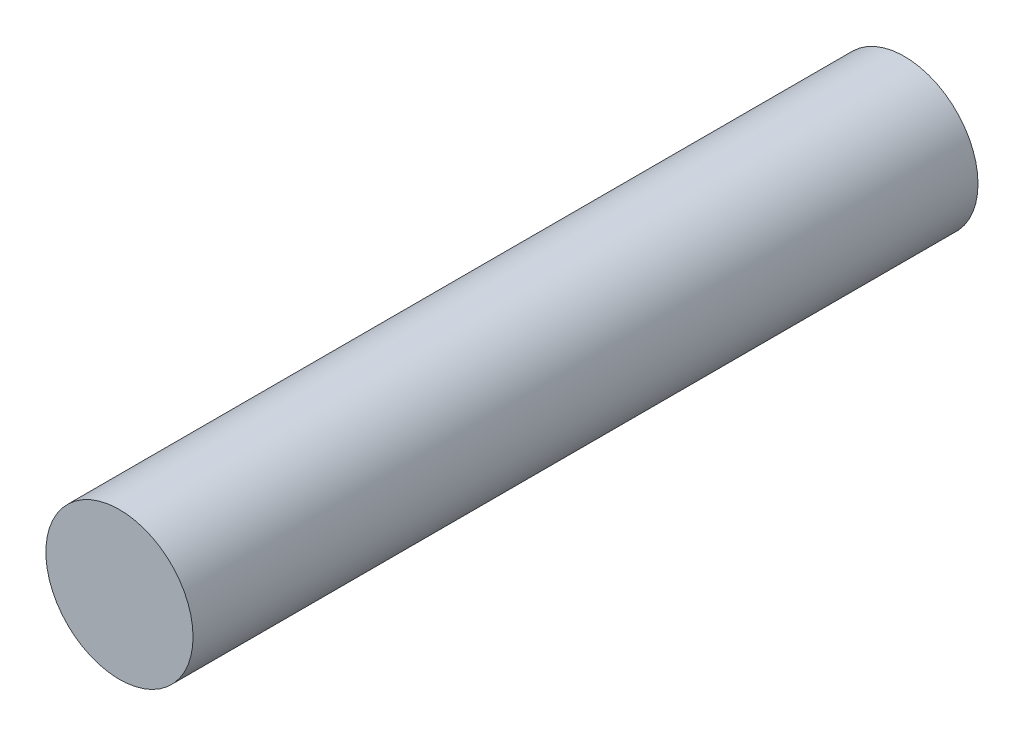
ISO-10303-21;
HEADER;
FILE_DESCRIPTION(('STEP AP214'),'2;1');
FILE_NAME('part.step','',(''),(''),'','','');
FILE_SCHEMA(('AUTOMOTIVE_DESIGN { 1 0 10303 214 1 1 1 1 }'));
ENDSEC;
DATA;
#1=APPLICATION_CONTEXT('core data for automotive mechanical design processes');
#2=APPLICATION_PROTOCOL_DEFINITION('international standard','automotive_design',2000,#1);
#3=PRODUCT_CONTEXT('',#1,'mechanical');
#4=PRODUCT('Part','Part','',(#3));
#5=PRODUCT_RELATED_PRODUCT_CATEGORY('part','',(#4));
#6=PRODUCT_DEFINITION_FORMATION('','',#4);
#7=PRODUCT_DEFINITION_CONTEXT('part definition',#1,'design');
#8=PRODUCT_DEFINITION('design','',#6,#7);
#9=PRODUCT_DEFINITION_SHAPE('','',#8);
#10=(LENGTH_UNIT() NAMED_UNIT(*) SI_UNIT(.MILLI.,.METRE.));
#11=(NAMED_UNIT(*) PLANE_ANGLE_UNIT() SI_UNIT($,.RADIAN.));
#12=(NAMED_UNIT(*) SI_UNIT($,.STERADIAN.) SOLID_ANGLE_UNIT());
#13=UNCERTAINTY_MEASURE_WITH_UNIT(LENGTH_MEASURE(1.E-05),#10,'distance_accuracy_value','');
#14=(GEOMETRIC_REPRESENTATION_CONTEXT(3) GLOBAL_UNCERTAINTY_ASSIGNED_CONTEXT((#13)) GLOBAL_UNIT_ASSIGNED_CONTEXT((#10,
#11,#12)) REPRESENTATION_CONTEXT('',''));
#15=CARTESIAN_POINT('',(0.,0.,0.));
#16=DIRECTION('',(0.,0.,1.));
#17=DIRECTION('',(1.,0.,0.));
#18=AXIS2_PLACEMENT_3D('',#15,#16,#17);
#19=CARTESIAN_POINT('',(0.,0.,-50.8));
#20=DIRECTION('',(0.,0.,1.));
#21=DIRECTION('',(1.,0.,0.));
#22=AXIS2_PLACEMENT_3D('',#19,#20,#21);
#23=CYLINDRICAL_SURFACE('',#22,4.7625);
#24=CARTESIAN_POINT('',(0.,0.,-50.8));
#25=DIRECTION('',(0.,0.,1.));
#26=DIRECTION('',(1.,0.,0.));
#27=AXIS2_PLACEMENT_3D('',#24,#25,#26);
#28=CIRCLE('',#27,4.7625);
#29=CARTESIAN_POINT('',(4.7625,0.,-50.8));
#30=VERTEX_POINT('',#29);
#31=EDGE_CURVE('E10',#30,#30,#28,.T.);
#32=ORIENTED_EDGE('',*,*,#31,.T.);
#33=EDGE_LOOP('',(#32));
#34=FACE_BOUND('',#33,.T.);
#35=CARTESIAN_POINT('',(0.,0.,0.));
#36=DIRECTION('',(0.,0.,1.));
#37=DIRECTION('',(1.,0.,0.));
#38=AXIS2_PLACEMENT_3D('',#35,#36,#37);
#39=CIRCLE('',#38,4.7625);
#40=CARTESIAN_POINT('',(4.7625,0.,0.));
#41=VERTEX_POINT('',#40);
#42=EDGE_CURVE('E36',#41,#41,#39,.T.);
#43=ORIENTED_EDGE('',*,*,#42,.F.);
#44=EDGE_LOOP('',(#43));
#45=FACE_BOUND('',#44,.T.);
#46=ADVANCED_FACE('F33',(#34,#45),#23,.T.);
#47=CARTESIAN_POINT('',(0.,0.,-50.8));
#48=DIRECTION('',(0.,0.,1.));
#49=DIRECTION('',(1.,0.,0.));
#50=AXIS2_PLACEMENT_3D('',#47,#48,#49);
#51=PLANE('',#50);
#52=ORIENTED_EDGE('',*,*,#31,.F.);
#53=EDGE_LOOP('',(#52));
#54=FACE_BOUND('',#53,.T.);
#55=ADVANCED_FACE('F48',(#54),#51,.F.);
#56=CARTESIAN_POINT('',(0.,0.,0.));
#57=DIRECTION('',(0.,0.,1.));
#58=DIRECTION('',(1.,0.,0.));
#59=AXIS2_PLACEMENT_3D('',#56,#57,#58);
#60=PLANE('',#59);
#61=ORIENTED_EDGE('',*,*,#42,.T.);
#62=EDGE_LOOP('',(#61));
#63=FACE_BOUND('',#62,.T.);
#64=ADVANCED_FACE('F45',(#63),#60,.T.);
#65=CLOSED_SHELL('',(#46,#55,#64));
#66=MANIFOLD_SOLID_BREP('B2',#65);
#67=ADVANCED_BREP_SHAPE_REPRESENTATION('',(#18,#66),#14);
#68=SHAPE_DEFINITION_REPRESENTATION(#9,#67);
ENDSEC;
END-ISO-10303-21;
